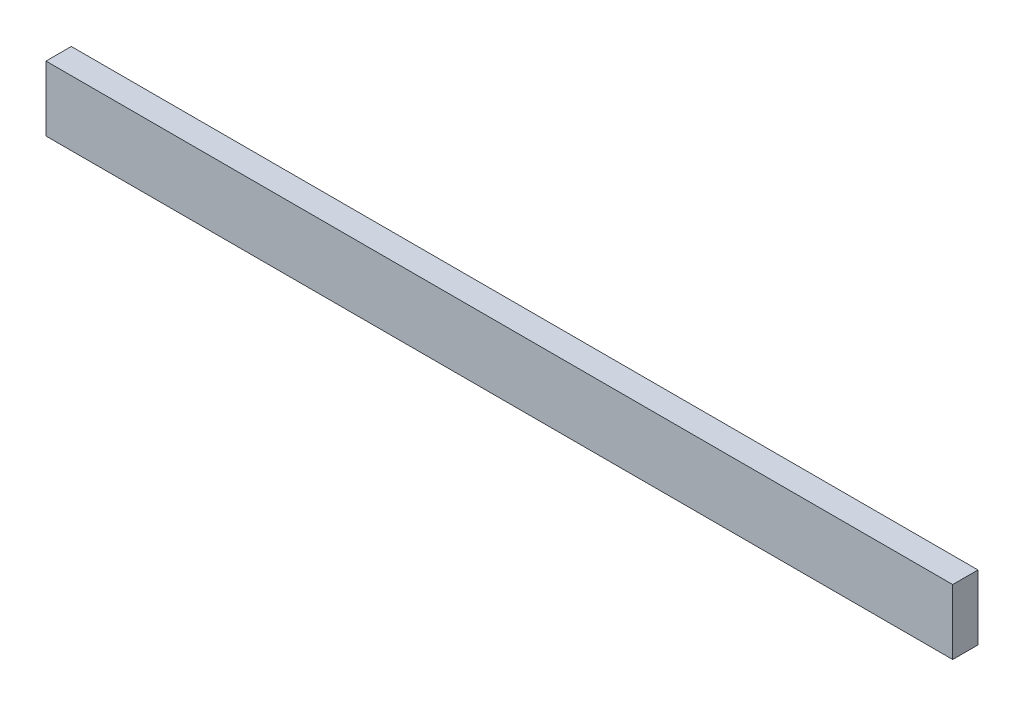
ISO-10303-21;
HEADER;
FILE_DESCRIPTION(('STEP AP214'),'2;1');
FILE_NAME('part.step','',(''),(''),'','','');
FILE_SCHEMA(('AUTOMOTIVE_DESIGN { 1 0 10303 214 1 1 1 1 }'));
ENDSEC;
DATA;
#1=APPLICATION_CONTEXT('core data for automotive mechanical design processes');
#2=APPLICATION_PROTOCOL_DEFINITION('international standard','automotive_design',2000,#1);
#3=PRODUCT_CONTEXT('',#1,'mechanical');
#4=PRODUCT('Part','Part','',(#3));
#5=PRODUCT_RELATED_PRODUCT_CATEGORY('part','',(#4));
#6=PRODUCT_DEFINITION_FORMATION('','',#4);
#7=PRODUCT_DEFINITION_CONTEXT('part definition',#1,'design');
#8=PRODUCT_DEFINITION('design','',#6,#7);
#9=PRODUCT_DEFINITION_SHAPE('','',#8);
#10=(LENGTH_UNIT() NAMED_UNIT(*) SI_UNIT(.MILLI.,.METRE.));
#11=(NAMED_UNIT(*) PLANE_ANGLE_UNIT() SI_UNIT($,.RADIAN.));
#12=(NAMED_UNIT(*) SI_UNIT($,.STERADIAN.) SOLID_ANGLE_UNIT());
#13=UNCERTAINTY_MEASURE_WITH_UNIT(LENGTH_MEASURE(1.E-05),#10,'distance_accuracy_value','');
#14=(GEOMETRIC_REPRESENTATION_CONTEXT(3) GLOBAL_UNCERTAINTY_ASSIGNED_CONTEXT((#13)) GLOBAL_UNIT_ASSIGNED_CONTEXT((#10,
#11,#12)) REPRESENTATION_CONTEXT('',''));
#15=CARTESIAN_POINT('',(0.,0.,0.));
#16=DIRECTION('',(0.,0.,1.));
#17=DIRECTION('',(1.,0.,0.));
#18=AXIS2_PLACEMENT_3D('',#15,#16,#17);
#19=CARTESIAN_POINT('',(0.,0.,0.));
#20=DIRECTION('',(0.,0.,1.));
#21=DIRECTION('',(0.,-1.,0.));
#22=AXIS2_PLACEMENT_3D('',#19,#20,#21);
#23=PLANE('',#22);
#24=DIRECTION('',(0.,1.,0.));
#25=VECTOR('',#24,1.);
#26=CARTESIAN_POINT('',(-18.4404,1.32080000000001,0.));
#27=LINE('',#26,#25);
#28=CARTESIAN_POINT('',(-18.4404,1.3208,0.));
#29=VERTEX_POINT('',#28);
#30=CARTESIAN_POINT('',(-18.4404,-1.3208,0.));
#31=VERTEX_POINT('',#30);
#32=EDGE_CURVE('E78',#29,#31,#27,.F.);
#33=ORIENTED_EDGE('',*,*,#32,.F.);
#34=DIRECTION('',(1.,0.,0.));
#35=VECTOR('',#34,1.);
#36=CARTESIAN_POINT('',(18.4404,1.3208,0.));
#37=LINE('',#36,#35);
#38=CARTESIAN_POINT('',(18.4404,1.3208,0.));
#39=VERTEX_POINT('',#38);
#40=EDGE_CURVE('E54',#39,#29,#37,.F.);
#41=ORIENTED_EDGE('',*,*,#40,.F.);
#42=DIRECTION('',(0.,1.,0.));
#43=VECTOR('',#42,1.);
#44=CARTESIAN_POINT('',(18.4404,-1.32080000000001,0.));
#45=LINE('',#44,#43);
#46=CARTESIAN_POINT('',(18.4404,-1.3208,0.));
#47=VERTEX_POINT('',#46);
#48=EDGE_CURVE('E56',#47,#39,#45,.T.);
#49=ORIENTED_EDGE('',*,*,#48,.F.);
#50=DIRECTION('',(1.,0.,0.));
#51=VECTOR('',#50,1.);
#52=CARTESIAN_POINT('',(-18.4404,-1.3208,0.));
#53=LINE('',#52,#51);
#54=EDGE_CURVE('E19',#31,#47,#53,.T.);
#55=ORIENTED_EDGE('',*,*,#54,.F.);
#56=EDGE_LOOP('',(#33,#41,#49,#55));
#57=FACE_BOUND('',#56,.T.);
#58=ADVANCED_FACE('F16',(#57),#23,.F.);
#59=CARTESIAN_POINT('',(-18.4404,-1.3208,0.));
#60=DIRECTION('',(0.,-1.,0.));
#61=DIRECTION('',(0.,0.,-1.));
#62=AXIS2_PLACEMENT_3D('',#59,#60,#61);
#63=PLANE('',#62);
#64=DIRECTION('',(1.,0.,0.));
#65=VECTOR('',#64,1.);
#66=CARTESIAN_POINT('',(0.,-1.3208,1.029));
#67=LINE('',#66,#65);
#68=CARTESIAN_POINT('',(-18.4404,-1.3208,1.029));
#69=VERTEX_POINT('',#68);
#70=CARTESIAN_POINT('',(18.4404,-1.32080000000001,1.029));
#71=VERTEX_POINT('',#70);
#72=EDGE_CURVE('E82',#69,#71,#67,.T.);
#73=ORIENTED_EDGE('',*,*,#72,.F.);
#74=DIRECTION('',(0.,0.,1.));
#75=VECTOR('',#74,1.);
#76=CARTESIAN_POINT('',(-18.4404,-1.3208,0.));
#77=LINE('',#76,#75);
#78=EDGE_CURVE('E67',#31,#69,#77,.T.);
#79=ORIENTED_EDGE('',*,*,#78,.F.);
#80=ORIENTED_EDGE('',*,*,#54,.T.);
#81=DIRECTION('',(0.,0.,-1.));
#82=VECTOR('',#81,1.);
#83=CARTESIAN_POINT('',(18.4404,-1.32080000000001,0.));
#84=LINE('',#83,#82);
#85=EDGE_CURVE('E62',#71,#47,#84,.T.);
#86=ORIENTED_EDGE('',*,*,#85,.F.);
#87=EDGE_LOOP('',(#73,#79,#80,#86));
#88=FACE_BOUND('',#87,.T.);
#89=ADVANCED_FACE('F64',(#88),#63,.T.);
#90=CARTESIAN_POINT('',(18.4404,-1.32080000000001,0.));
#91=DIRECTION('',(1.,0.,0.));
#92=DIRECTION('',(0.,0.,-1.));
#93=AXIS2_PLACEMENT_3D('',#90,#91,#92);
#94=PLANE('',#93);
#95=DIRECTION('',(0.,-1.,0.));
#96=VECTOR('',#95,1.);
#97=CARTESIAN_POINT('',(18.4404,0.,1.029));
#98=LINE('',#97,#96);
#99=CARTESIAN_POINT('',(18.4404,1.3208,1.029));
#100=VERTEX_POINT('',#99);
#101=EDGE_CURVE('E71',#71,#100,#98,.F.);
#102=ORIENTED_EDGE('',*,*,#101,.F.);
#103=ORIENTED_EDGE('',*,*,#85,.T.);
#104=ORIENTED_EDGE('',*,*,#48,.T.);
#105=DIRECTION('',(0.,0.,1.));
#106=VECTOR('',#105,1.);
#107=CARTESIAN_POINT('',(18.4404,1.3208,0.));
#108=LINE('',#107,#106);
#109=EDGE_CURVE('E74',#100,#39,#108,.F.);
#110=ORIENTED_EDGE('',*,*,#109,.F.);
#111=EDGE_LOOP('',(#102,#103,#104,#110));
#112=FACE_BOUND('',#111,.T.);
#113=ADVANCED_FACE('F69',(#112),#94,.T.);
#114=CARTESIAN_POINT('',(18.4404,1.3208,0.));
#115=DIRECTION('',(0.,1.,0.));
#116=DIRECTION('',(0.,0.,1.));
#117=AXIS2_PLACEMENT_3D('',#114,#115,#116);
#118=PLANE('',#117);
#119=DIRECTION('',(1.,0.,0.));
#120=VECTOR('',#119,1.);
#121=CARTESIAN_POINT('',(0.,1.3208,1.029));
#122=LINE('',#121,#120);
#123=CARTESIAN_POINT('',(-18.4404,1.32080000000001,1.029));
#124=VERTEX_POINT('',#123);
#125=EDGE_CURVE('E25',#100,#124,#122,.F.);
#126=ORIENTED_EDGE('',*,*,#125,.F.);
#127=ORIENTED_EDGE('',*,*,#109,.T.);
#128=ORIENTED_EDGE('',*,*,#40,.T.);
#129=DIRECTION('',(0.,0.,1.));
#130=VECTOR('',#129,1.);
#131=CARTESIAN_POINT('',(-18.4404,1.32080000000001,0.));
#132=LINE('',#131,#130);
#133=EDGE_CURVE('E34',#124,#29,#132,.F.);
#134=ORIENTED_EDGE('',*,*,#133,.F.);
#135=EDGE_LOOP('',(#126,#127,#128,#134));
#136=FACE_BOUND('',#135,.T.);
#137=ADVANCED_FACE('F88',(#136),#118,.T.);
#138=CARTESIAN_POINT('',(-18.4404,1.32080000000001,0.));
#139=DIRECTION('',(-1.,0.,0.));
#140=DIRECTION('',(0.,0.,1.));
#141=AXIS2_PLACEMENT_3D('',#138,#139,#140);
#142=PLANE('',#141);
#143=DIRECTION('',(0.,-1.,0.));
#144=VECTOR('',#143,1.);
#145=CARTESIAN_POINT('',(-18.4404,0.,1.029));
#146=LINE('',#145,#144);
#147=EDGE_CURVE('E11',#124,#69,#146,.T.);
#148=ORIENTED_EDGE('',*,*,#147,.F.);
#149=ORIENTED_EDGE('',*,*,#133,.T.);
#150=ORIENTED_EDGE('',*,*,#32,.T.);
#151=ORIENTED_EDGE('',*,*,#78,.T.);
#152=EDGE_LOOP('',(#148,#149,#150,#151));
#153=FACE_BOUND('',#152,.T.);
#154=ADVANCED_FACE('F90',(#153),#142,.T.);
#155=CARTESIAN_POINT('',(0.,0.,1.029));
#156=DIRECTION('',(0.,0.,1.));
#157=DIRECTION('',(0.,-1.,0.));
#158=AXIS2_PLACEMENT_3D('',#155,#156,#157);
#159=PLANE('',#158);
#160=ORIENTED_EDGE('',*,*,#125,.T.);
#161=ORIENTED_EDGE('',*,*,#147,.T.);
#162=ORIENTED_EDGE('',*,*,#72,.T.);
#163=ORIENTED_EDGE('',*,*,#101,.T.);
#164=EDGE_LOOP('',(#160,#161,#162,#163));
#165=FACE_BOUND('',#164,.T.);
#166=ADVANCED_FACE('F87',(#165),#159,.T.);
#167=CLOSED_SHELL('',(#58,#89,#113,#137,#154,#166));
#168=MANIFOLD_SOLID_BREP('B1',#167);
#169=ADVANCED_BREP_SHAPE_REPRESENTATION('',(#18,#168),#14);
#170=SHAPE_DEFINITION_REPRESENTATION(#9,#169);
ENDSEC;
END-ISO-10303-21;
